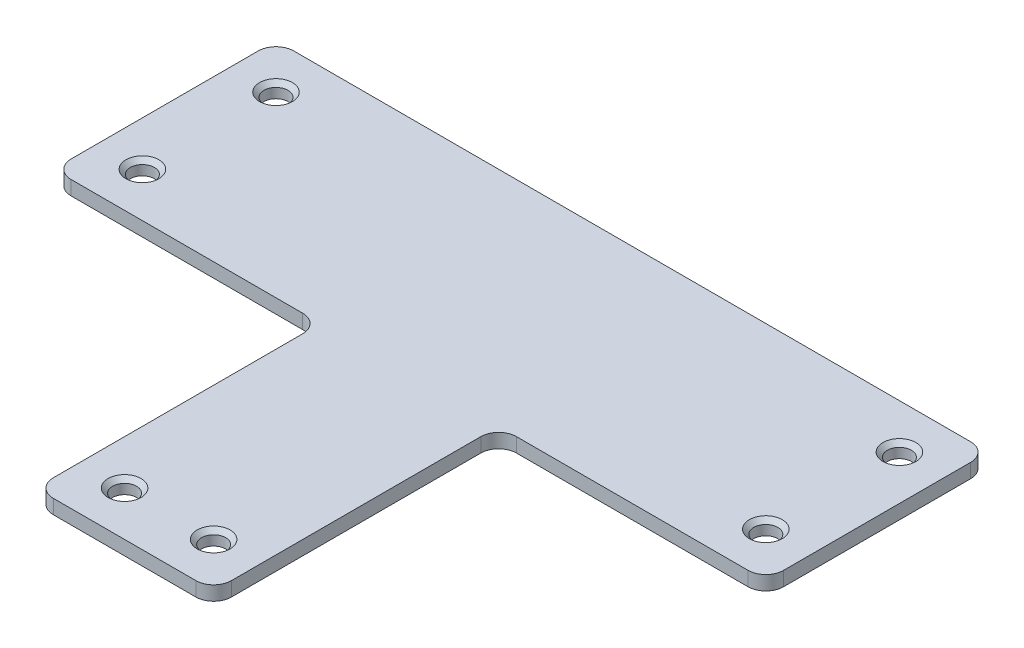
ISO-10303-21;
HEADER;
FILE_DESCRIPTION(('STEP AP214'),'2;1');
FILE_NAME('part.step','',(''),(''),'','','');
FILE_SCHEMA(('AUTOMOTIVE_DESIGN { 1 0 10303 214 1 1 1 1 }'));
ENDSEC;
DATA;
#1=APPLICATION_CONTEXT('core data for automotive mechanical design processes');
#2=APPLICATION_PROTOCOL_DEFINITION('international standard','automotive_design',2000,#1);
#3=PRODUCT_CONTEXT('',#1,'mechanical');
#4=PRODUCT('Part','Part','',(#3));
#5=PRODUCT_RELATED_PRODUCT_CATEGORY('part','',(#4));
#6=PRODUCT_DEFINITION_FORMATION('','',#4);
#7=PRODUCT_DEFINITION_CONTEXT('part definition',#1,'design');
#8=PRODUCT_DEFINITION('design','',#6,#7);
#9=PRODUCT_DEFINITION_SHAPE('','',#8);
#10=(LENGTH_UNIT() NAMED_UNIT(*) SI_UNIT(.MILLI.,.METRE.));
#11=(NAMED_UNIT(*) PLANE_ANGLE_UNIT() SI_UNIT($,.RADIAN.));
#12=(NAMED_UNIT(*) SI_UNIT($,.STERADIAN.) SOLID_ANGLE_UNIT());
#13=UNCERTAINTY_MEASURE_WITH_UNIT(LENGTH_MEASURE(1.E-05),#10,'distance_accuracy_value','');
#14=(GEOMETRIC_REPRESENTATION_CONTEXT(3) GLOBAL_UNCERTAINTY_ASSIGNED_CONTEXT((#13)) GLOBAL_UNIT_ASSIGNED_CONTEXT((#10,
#11,#12)) REPRESENTATION_CONTEXT('',''));
#15=CARTESIAN_POINT('',(0.,0.,0.));
#16=DIRECTION('',(0.,0.,1.));
#17=DIRECTION('',(1.,0.,0.));
#18=AXIS2_PLACEMENT_3D('',#15,#16,#17);
#19=CARTESIAN_POINT('',(-40.,1.6,12.5));
#20=DIRECTION('',(0.,0.,-1.));
#21=DIRECTION('',(-1.,0.,0.));
#22=AXIS2_PLACEMENT_3D('',#19,#20,#21);
#23=PLANE('',#22);
#24=DIRECTION('',(1.,0.,0.));
#25=VECTOR('',#24,1.);
#26=CARTESIAN_POINT('',(-40.,0.,12.5));
#27=LINE('',#26,#25);
#28=CARTESIAN_POINT('',(12.,0.,12.5));
#29=VERTEX_POINT('',#28);
#30=CARTESIAN_POINT('',(38.,0.,12.5));
#31=VERTEX_POINT('',#30);
#32=EDGE_CURVE('E176',#29,#31,#27,.T.);
#33=ORIENTED_EDGE('',*,*,#32,.T.);
#34=DIRECTION('',(0.,-1.,0.));
#35=VECTOR('',#34,1.);
#36=CARTESIAN_POINT('',(38.,1.6,12.5));
#37=LINE('',#36,#35);
#38=CARTESIAN_POINT('',(38.,1.6,12.5));
#39=VERTEX_POINT('',#38);
#40=EDGE_CURVE('E52',#31,#39,#37,.F.);
#41=ORIENTED_EDGE('',*,*,#40,.T.);
#42=DIRECTION('',(1.,0.,0.));
#43=VECTOR('',#42,1.);
#44=CARTESIAN_POINT('',(-40.,1.6,12.5));
#45=LINE('',#44,#43);
#46=CARTESIAN_POINT('',(12.,1.6,12.5));
#47=VERTEX_POINT('',#46);
#48=EDGE_CURVE('E214',#47,#39,#45,.T.);
#49=ORIENTED_EDGE('',*,*,#48,.F.);
#50=DIRECTION('',(0.,1.,0.));
#51=VECTOR('',#50,1.);
#52=CARTESIAN_POINT('',(12.,1.6,12.5));
#53=LINE('',#52,#51);
#54=EDGE_CURVE('E410',#47,#29,#53,.F.);
#55=ORIENTED_EDGE('',*,*,#54,.T.);
#56=EDGE_LOOP('',(#33,#41,#49,#55));
#57=FACE_BOUND('',#56,.T.);
#58=ADVANCED_FACE('F37',(#57),#23,.F.);
#59=CARTESIAN_POINT('',(40.,1.6,12.5));
#60=DIRECTION('',(-1.,0.,0.));
#61=DIRECTION('',(0.,0.,1.));
#62=AXIS2_PLACEMENT_3D('',#59,#60,#61);
#63=PLANE('',#62);
#64=DIRECTION('',(0.,0.,-1.));
#65=VECTOR('',#64,1.);
#66=CARTESIAN_POINT('',(40.,0.,12.5));
#67=LINE('',#66,#65);
#68=CARTESIAN_POINT('',(40.,0.,10.5));
#69=VERTEX_POINT('',#68);
#70=CARTESIAN_POINT('',(40.,0.,-10.5));
#71=VERTEX_POINT('',#70);
#72=EDGE_CURVE('E181',#69,#71,#67,.T.);
#73=ORIENTED_EDGE('',*,*,#72,.T.);
#74=DIRECTION('',(0.,-1.,0.));
#75=VECTOR('',#74,1.);
#76=CARTESIAN_POINT('',(40.,1.6,-10.5));
#77=LINE('',#76,#75);
#78=CARTESIAN_POINT('',(40.,1.6,-10.5));
#79=VERTEX_POINT('',#78);
#80=EDGE_CURVE('E408',#71,#79,#77,.F.);
#81=ORIENTED_EDGE('',*,*,#80,.T.);
#82=DIRECTION('',(0.,0.,-1.));
#83=VECTOR('',#82,1.);
#84=CARTESIAN_POINT('',(40.,1.6,12.5));
#85=LINE('',#84,#83);
#86=CARTESIAN_POINT('',(40.,1.6,10.5));
#87=VERTEX_POINT('',#86);
#88=EDGE_CURVE('E278',#87,#79,#85,.T.);
#89=ORIENTED_EDGE('',*,*,#88,.F.);
#90=DIRECTION('',(0.,-1.,0.));
#91=VECTOR('',#90,1.);
#92=CARTESIAN_POINT('',(40.,1.6,10.5));
#93=LINE('',#92,#91);
#94=EDGE_CURVE('E405',#87,#69,#93,.T.);
#95=ORIENTED_EDGE('',*,*,#94,.T.);
#96=EDGE_LOOP('',(#73,#81,#89,#95));
#97=FACE_BOUND('',#96,.T.);
#98=ADVANCED_FACE('F326',(#97),#63,.F.);
#99=CARTESIAN_POINT('',(-40.,1.6,-12.5));
#100=DIRECTION('',(0.,0.,1.));
#101=DIRECTION('',(1.,0.,0.));
#102=AXIS2_PLACEMENT_3D('',#99,#100,#101);
#103=PLANE('',#102);
#104=DIRECTION('',(-1.,0.,0.));
#105=VECTOR('',#104,1.);
#106=CARTESIAN_POINT('',(-40.,0.,-12.5));
#107=LINE('',#106,#105);
#108=CARTESIAN_POINT('',(38.,0.,-12.5));
#109=VERTEX_POINT('',#108);
#110=CARTESIAN_POINT('',(-38.,0.,-12.5));
#111=VERTEX_POINT('',#110);
#112=EDGE_CURVE('E177',#109,#111,#107,.T.);
#113=ORIENTED_EDGE('',*,*,#112,.T.);
#114=DIRECTION('',(0.,-1.,0.));
#115=VECTOR('',#114,1.);
#116=CARTESIAN_POINT('',(-38.,1.6,-12.5));
#117=LINE('',#116,#115);
#118=CARTESIAN_POINT('',(-38.,1.6,-12.5));
#119=VERTEX_POINT('',#118);
#120=EDGE_CURVE('E155',#111,#119,#117,.F.);
#121=ORIENTED_EDGE('',*,*,#120,.T.);
#122=DIRECTION('',(-1.,0.,0.));
#123=VECTOR('',#122,1.);
#124=CARTESIAN_POINT('',(-40.,1.6,-12.5));
#125=LINE('',#124,#123);
#126=CARTESIAN_POINT('',(38.,1.6,-12.5));
#127=VERTEX_POINT('',#126);
#128=EDGE_CURVE('E280',#127,#119,#125,.T.);
#129=ORIENTED_EDGE('',*,*,#128,.F.);
#130=DIRECTION('',(0.,-1.,0.));
#131=VECTOR('',#130,1.);
#132=CARTESIAN_POINT('',(38.,1.6,-12.5));
#133=LINE('',#132,#131);
#134=EDGE_CURVE('E160',#127,#109,#133,.T.);
#135=ORIENTED_EDGE('',*,*,#134,.T.);
#136=EDGE_LOOP('',(#113,#121,#129,#135));
#137=FACE_BOUND('',#136,.T.);
#138=ADVANCED_FACE('F331',(#137),#103,.F.);
#139=CARTESIAN_POINT('',(-40.,1.6,12.5));
#140=DIRECTION('',(1.,0.,0.));
#141=DIRECTION('',(0.,0.,-1.));
#142=AXIS2_PLACEMENT_3D('',#139,#140,#141);
#143=PLANE('',#142);
#144=DIRECTION('',(0.,0.,1.));
#145=VECTOR('',#144,1.);
#146=CARTESIAN_POINT('',(-40.,1.6,12.5));
#147=LINE('',#146,#145);
#148=CARTESIAN_POINT('',(-40.,1.6,-10.5));
#149=VERTEX_POINT('',#148);
#150=CARTESIAN_POINT('',(-40.,1.6,10.5));
#151=VERTEX_POINT('',#150);
#152=EDGE_CURVE('E170',#149,#151,#147,.T.);
#153=ORIENTED_EDGE('',*,*,#152,.F.);
#154=DIRECTION('',(0.,-1.,0.));
#155=VECTOR('',#154,1.);
#156=CARTESIAN_POINT('',(-40.,1.6,-10.5));
#157=LINE('',#156,#155);
#158=CARTESIAN_POINT('',(-40.,0.,-10.5));
#159=VERTEX_POINT('',#158);
#160=EDGE_CURVE('E154',#149,#159,#157,.T.);
#161=ORIENTED_EDGE('',*,*,#160,.T.);
#162=DIRECTION('',(0.,0.,1.));
#163=VECTOR('',#162,1.);
#164=CARTESIAN_POINT('',(-40.,0.,12.5));
#165=LINE('',#164,#163);
#166=CARTESIAN_POINT('',(-40.,0.,10.5));
#167=VERTEX_POINT('',#166);
#168=EDGE_CURVE('E167',#159,#167,#165,.T.);
#169=ORIENTED_EDGE('',*,*,#168,.T.);
#170=DIRECTION('',(0.,-1.,0.));
#171=VECTOR('',#170,1.);
#172=CARTESIAN_POINT('',(-40.,1.6,10.5));
#173=LINE('',#172,#171);
#174=EDGE_CURVE('E172',#167,#151,#173,.F.);
#175=ORIENTED_EDGE('',*,*,#174,.T.);
#176=EDGE_LOOP('',(#153,#161,#169,#175));
#177=FACE_BOUND('',#176,.T.);
#178=ADVANCED_FACE('F166',(#177),#143,.F.);
#179=CARTESIAN_POINT('',(-38.,0.,12.5));
#180=VERTEX_POINT('',#179);
#181=CARTESIAN_POINT('',(-12.,0.,12.5));
#182=VERTEX_POINT('',#181);
#183=EDGE_CURVE('E179',#180,#182,#27,.T.);
#184=ORIENTED_EDGE('',*,*,#183,.T.);
#185=DIRECTION('',(0.,1.,0.));
#186=VECTOR('',#185,1.);
#187=CARTESIAN_POINT('',(-12.,1.6,12.5));
#188=LINE('',#187,#186);
#189=CARTESIAN_POINT('',(-12.,1.6,12.5));
#190=VERTEX_POINT('',#189);
#191=EDGE_CURVE('E257',#182,#190,#188,.T.);
#192=ORIENTED_EDGE('',*,*,#191,.T.);
#193=CARTESIAN_POINT('',(-38.,1.6,12.5));
#194=VERTEX_POINT('',#193);
#195=EDGE_CURVE('E217',#194,#190,#45,.T.);
#196=ORIENTED_EDGE('',*,*,#195,.F.);
#197=DIRECTION('',(0.,-1.,0.));
#198=VECTOR('',#197,1.);
#199=CARTESIAN_POINT('',(-38.,1.6,12.5));
#200=LINE('',#199,#198);
#201=EDGE_CURVE('E254',#194,#180,#200,.T.);
#202=ORIENTED_EDGE('',*,*,#201,.T.);
#203=EDGE_LOOP('',(#184,#192,#196,#202));
#204=FACE_BOUND('',#203,.T.);
#205=ADVANCED_FACE('F276',(#204),#23,.F.);
#206=CARTESIAN_POINT('',(0.,1.6,0.));
#207=DIRECTION('',(0.,-1.,0.));
#208=DIRECTION('',(0.,0.,-1.));
#209=AXIS2_PLACEMENT_3D('',#206,#207,#208);
#210=PLANE('',#209);
#211=CARTESIAN_POINT('',(35.,1.6,-7.5));
#212=DIRECTION('',(0.,-1.,0.));
#213=DIRECTION('',(0.,0.,-1.));
#214=AXIS2_PLACEMENT_3D('',#211,#212,#213);
#215=CIRCLE('',#214,1.85000000000003);
#216=CARTESIAN_POINT('',(35.,1.6,-9.35000000000003));
#217=VERTEX_POINT('',#216);
#218=EDGE_CURVE('E610',#217,#217,#215,.T.);
#219=ORIENTED_EDGE('',*,*,#218,.T.);
#220=EDGE_LOOP('',(#219));
#221=FACE_BOUND('',#220,.T.);
#222=CARTESIAN_POINT('',(35.,1.6,7.5));
#223=DIRECTION('',(0.,-1.,0.));
#224=DIRECTION('',(0.,0.,-1.));
#225=AXIS2_PLACEMENT_3D('',#222,#223,#224);
#226=CIRCLE('',#225,1.85000000000003);
#227=CARTESIAN_POINT('',(35.,1.6,5.64999999999997));
#228=VERTEX_POINT('',#227);
#229=EDGE_CURVE('E613',#228,#228,#226,.T.);
#230=ORIENTED_EDGE('',*,*,#229,.T.);
#231=EDGE_LOOP('',(#230));
#232=FACE_BOUND('',#231,.T.);
#233=CARTESIAN_POINT('',(5.00000000000001,1.6,39.5));
#234=DIRECTION('',(0.,-1.,0.));
#235=DIRECTION('',(0.,0.,-1.));
#236=AXIS2_PLACEMENT_3D('',#233,#234,#235);
#237=CIRCLE('',#236,1.85);
#238=CARTESIAN_POINT('',(5.00000000000001,1.6,37.65));
#239=VERTEX_POINT('',#238);
#240=EDGE_CURVE('E616',#239,#239,#237,.T.);
#241=ORIENTED_EDGE('',*,*,#240,.T.);
#242=EDGE_LOOP('',(#241));
#243=FACE_BOUND('',#242,.T.);
#244=CARTESIAN_POINT('',(-4.99999999999999,1.6,39.5));
#245=DIRECTION('',(0.,-1.,0.));
#246=DIRECTION('',(0.,0.,-1.));
#247=AXIS2_PLACEMENT_3D('',#244,#245,#246);
#248=CIRCLE('',#247,1.85);
#249=CARTESIAN_POINT('',(-4.99999999999999,1.6,37.65));
#250=VERTEX_POINT('',#249);
#251=EDGE_CURVE('E619',#250,#250,#248,.T.);
#252=ORIENTED_EDGE('',*,*,#251,.T.);
#253=EDGE_LOOP('',(#252));
#254=FACE_BOUND('',#253,.T.);
#255=CARTESIAN_POINT('',(-35.,1.6,7.5));
#256=DIRECTION('',(0.,-1.,0.));
#257=DIRECTION('',(0.,0.,-1.));
#258=AXIS2_PLACEMENT_3D('',#255,#256,#257);
#259=CIRCLE('',#258,1.85000000000003);
#260=CARTESIAN_POINT('',(-35.,1.6,5.64999999999997));
#261=VERTEX_POINT('',#260);
#262=EDGE_CURVE('E622',#261,#261,#259,.T.);
#263=ORIENTED_EDGE('',*,*,#262,.T.);
#264=EDGE_LOOP('',(#263));
#265=FACE_BOUND('',#264,.T.);
#266=CARTESIAN_POINT('',(-35.,1.6,-7.5));
#267=DIRECTION('',(0.,-1.,0.));
#268=DIRECTION('',(0.,0.,-1.));
#269=AXIS2_PLACEMENT_3D('',#266,#267,#268);
#270=CIRCLE('',#269,1.85000000000003);
#271=CARTESIAN_POINT('',(-35.,1.6,-9.35000000000003));
#272=VERTEX_POINT('',#271);
#273=EDGE_CURVE('E624',#272,#272,#270,.T.);
#274=ORIENTED_EDGE('',*,*,#273,.T.);
#275=EDGE_LOOP('',(#274));
#276=FACE_BOUND('',#275,.T.);
#277=ORIENTED_EDGE('',*,*,#128,.T.);
#278=CARTESIAN_POINT('',(-38.,1.6,-10.5));
#279=DIRECTION('',(0.,-1.,0.));
#280=DIRECTION('',(0.,0.,-1.));
#281=AXIS2_PLACEMENT_3D('',#278,#279,#280);
#282=CIRCLE('',#281,2.);
#283=EDGE_CURVE('E403',#119,#149,#282,.F.);
#284=ORIENTED_EDGE('',*,*,#283,.T.);
#285=ORIENTED_EDGE('',*,*,#152,.T.);
#286=CARTESIAN_POINT('',(-38.,1.6,10.5));
#287=DIRECTION('',(0.,-1.,0.));
#288=DIRECTION('',(0.,0.,-1.));
#289=AXIS2_PLACEMENT_3D('',#286,#287,#288);
#290=CIRCLE('',#289,2.);
#291=EDGE_CURVE('E218',#151,#194,#290,.F.);
#292=ORIENTED_EDGE('',*,*,#291,.T.);
#293=ORIENTED_EDGE('',*,*,#195,.T.);
#294=CARTESIAN_POINT('',(-12.,1.6,14.5));
#295=DIRECTION('',(0.,-1.,0.));
#296=DIRECTION('',(0.,0.,-1.));
#297=AXIS2_PLACEMENT_3D('',#294,#295,#296);
#298=CIRCLE('',#297,2.);
#299=CARTESIAN_POINT('',(-9.99999999999999,1.6,14.5));
#300=VERTEX_POINT('',#299);
#301=EDGE_CURVE('E45',#190,#300,#298,.T.);
#302=ORIENTED_EDGE('',*,*,#301,.T.);
#303=DIRECTION('',(0.,0.,1.));
#304=VECTOR('',#303,1.);
#305=CARTESIAN_POINT('',(-9.99999999999999,1.6,12.5));
#306=LINE('',#305,#304);
#307=CARTESIAN_POINT('',(-9.99999999999999,1.6,42.5));
#308=VERTEX_POINT('',#307);
#309=EDGE_CURVE('E212',#300,#308,#306,.T.);
#310=ORIENTED_EDGE('',*,*,#309,.T.);
#311=CARTESIAN_POINT('',(-7.99999999999999,1.6,42.5));
#312=DIRECTION('',(0.,-1.,0.));
#313=DIRECTION('',(0.,0.,-1.));
#314=AXIS2_PLACEMENT_3D('',#311,#312,#313);
#315=CIRCLE('',#314,2.);
#316=CARTESIAN_POINT('',(-7.99999999999999,1.6,44.5));
#317=VERTEX_POINT('',#316);
#318=EDGE_CURVE('E253',#308,#317,#315,.F.);
#319=ORIENTED_EDGE('',*,*,#318,.T.);
#320=DIRECTION('',(1.,0.,0.));
#321=VECTOR('',#320,1.);
#322=CARTESIAN_POINT('',(-9.99999999999999,1.6,44.5));
#323=LINE('',#322,#321);
#324=CARTESIAN_POINT('',(8.00000000000001,1.6,44.5));
#325=VERTEX_POINT('',#324);
#326=EDGE_CURVE('E211',#317,#325,#323,.T.);
#327=ORIENTED_EDGE('',*,*,#326,.T.);
#328=CARTESIAN_POINT('',(8.00000000000001,1.6,42.5));
#329=DIRECTION('',(0.,-1.,0.));
#330=DIRECTION('',(0.,0.,-1.));
#331=AXIS2_PLACEMENT_3D('',#328,#329,#330);
#332=CIRCLE('',#331,2.);
#333=CARTESIAN_POINT('',(10.,1.6,42.5));
#334=VERTEX_POINT('',#333);
#335=EDGE_CURVE('E395',#325,#334,#332,.F.);
#336=ORIENTED_EDGE('',*,*,#335,.T.);
#337=DIRECTION('',(0.,0.,-1.));
#338=VECTOR('',#337,1.);
#339=CARTESIAN_POINT('',(10.,1.6,12.5));
#340=LINE('',#339,#338);
#341=CARTESIAN_POINT('',(10.,1.6,14.5));
#342=VERTEX_POINT('',#341);
#343=EDGE_CURVE('E208',#334,#342,#340,.T.);
#344=ORIENTED_EDGE('',*,*,#343,.T.);
#345=CARTESIAN_POINT('',(12.,1.6,14.5));
#346=DIRECTION('',(0.,-1.,0.));
#347=DIRECTION('',(0.,0.,-1.));
#348=AXIS2_PLACEMENT_3D('',#345,#346,#347);
#349=CIRCLE('',#348,2.);
#350=EDGE_CURVE('E59',#342,#47,#349,.T.);
#351=ORIENTED_EDGE('',*,*,#350,.T.);
#352=ORIENTED_EDGE('',*,*,#48,.T.);
#353=CARTESIAN_POINT('',(38.,1.6,10.5));
#354=DIRECTION('',(0.,-1.,0.));
#355=DIRECTION('',(0.,0.,-1.));
#356=AXIS2_PLACEMENT_3D('',#353,#354,#355);
#357=CIRCLE('',#356,2.);
#358=EDGE_CURVE('E397',#39,#87,#357,.F.);
#359=ORIENTED_EDGE('',*,*,#358,.T.);
#360=ORIENTED_EDGE('',*,*,#88,.T.);
#361=CARTESIAN_POINT('',(38.,1.6,-10.5));
#362=DIRECTION('',(0.,-1.,0.));
#363=DIRECTION('',(0.,0.,-1.));
#364=AXIS2_PLACEMENT_3D('',#361,#362,#363);
#365=CIRCLE('',#364,2.);
#366=EDGE_CURVE('E401',#79,#127,#365,.F.);
#367=ORIENTED_EDGE('',*,*,#366,.T.);
#368=EDGE_LOOP('',(#277,#284,#285,#292,#293,#302,#310,#319,#327,#336,#344,#351,#352,#359,#360,#367));
#369=FACE_BOUND('',#368,.T.);
#370=ADVANCED_FACE('F268',(#221,#232,#243,#254,#265,#276,#369),#210,.F.);
#371=CARTESIAN_POINT('',(0.,0.,0.));
#372=DIRECTION('',(0.,-1.,0.));
#373=DIRECTION('',(0.,0.,-1.));
#374=AXIS2_PLACEMENT_3D('',#371,#372,#373);
#375=PLANE('',#374);
#376=CARTESIAN_POINT('',(5.00000000000001,0.,39.5));
#377=DIRECTION('',(0.,1.,0.));
#378=DIRECTION('',(0.,0.,1.));
#379=AXIS2_PLACEMENT_3D('',#376,#377,#378);
#380=CIRCLE('',#379,1.35);
#381=CARTESIAN_POINT('',(5.00000000000001,0.,40.85));
#382=VERTEX_POINT('',#381);
#383=EDGE_CURVE('E302',#382,#382,#380,.T.);
#384=ORIENTED_EDGE('',*,*,#383,.T.);
#385=EDGE_LOOP('',(#384));
#386=FACE_BOUND('',#385,.T.);
#387=CARTESIAN_POINT('',(-4.99999999999999,0.,39.5));
#388=DIRECTION('',(0.,1.,0.));
#389=DIRECTION('',(0.,0.,1.));
#390=AXIS2_PLACEMENT_3D('',#387,#388,#389);
#391=CIRCLE('',#390,1.35);
#392=CARTESIAN_POINT('',(-4.99999999999999,0.,40.85));
#393=VERTEX_POINT('',#392);
#394=EDGE_CURVE('E299',#393,#393,#391,.T.);
#395=ORIENTED_EDGE('',*,*,#394,.T.);
#396=EDGE_LOOP('',(#395));
#397=FACE_BOUND('',#396,.T.);
#398=CARTESIAN_POINT('',(35.,0.,7.5));
#399=DIRECTION('',(0.,1.,0.));
#400=DIRECTION('',(0.,0.,1.));
#401=AXIS2_PLACEMENT_3D('',#398,#399,#400);
#402=CIRCLE('',#401,1.35);
#403=CARTESIAN_POINT('',(35.,0.,8.85));
#404=VERTEX_POINT('',#403);
#405=EDGE_CURVE('E296',#404,#404,#402,.T.);
#406=ORIENTED_EDGE('',*,*,#405,.T.);
#407=EDGE_LOOP('',(#406));
#408=FACE_BOUND('',#407,.T.);
#409=CARTESIAN_POINT('',(-35.,0.,7.5));
#410=DIRECTION('',(0.,1.,0.));
#411=DIRECTION('',(0.,0.,1.));
#412=AXIS2_PLACEMENT_3D('',#409,#410,#411);
#413=CIRCLE('',#412,1.35);
#414=CARTESIAN_POINT('',(-35.,0.,8.85));
#415=VERTEX_POINT('',#414);
#416=EDGE_CURVE('E293',#415,#415,#413,.T.);
#417=ORIENTED_EDGE('',*,*,#416,.T.);
#418=EDGE_LOOP('',(#417));
#419=FACE_BOUND('',#418,.T.);
#420=CARTESIAN_POINT('',(35.,0.,-7.5));
#421=DIRECTION('',(0.,1.,0.));
#422=DIRECTION('',(0.,0.,1.));
#423=AXIS2_PLACEMENT_3D('',#420,#421,#422);
#424=CIRCLE('',#423,1.35);
#425=CARTESIAN_POINT('',(35.,0.,-6.15));
#426=VERTEX_POINT('',#425);
#427=EDGE_CURVE('E290',#426,#426,#424,.T.);
#428=ORIENTED_EDGE('',*,*,#427,.T.);
#429=EDGE_LOOP('',(#428));
#430=FACE_BOUND('',#429,.T.);
#431=CARTESIAN_POINT('',(-35.,0.,-7.5));
#432=DIRECTION('',(0.,1.,0.));
#433=DIRECTION('',(0.,0.,1.));
#434=AXIS2_PLACEMENT_3D('',#431,#432,#433);
#435=CIRCLE('',#434,1.35);
#436=CARTESIAN_POINT('',(-35.,0.,-6.15));
#437=VERTEX_POINT('',#436);
#438=EDGE_CURVE('E272',#437,#437,#435,.T.);
#439=ORIENTED_EDGE('',*,*,#438,.T.);
#440=EDGE_LOOP('',(#439));
#441=FACE_BOUND('',#440,.T.);
#442=ORIENTED_EDGE('',*,*,#168,.F.);
#443=CARTESIAN_POINT('',(-38.,0.,-10.5));
#444=DIRECTION('',(0.,-1.,0.));
#445=DIRECTION('',(0.,0.,-1.));
#446=AXIS2_PLACEMENT_3D('',#443,#444,#445);
#447=CIRCLE('',#446,2.);
#448=EDGE_CURVE('E150',#159,#111,#447,.T.);
#449=ORIENTED_EDGE('',*,*,#448,.T.);
#450=ORIENTED_EDGE('',*,*,#112,.F.);
#451=CARTESIAN_POINT('',(38.,0.,-10.5));
#452=DIRECTION('',(0.,-1.,0.));
#453=DIRECTION('',(0.,0.,-1.));
#454=AXIS2_PLACEMENT_3D('',#451,#452,#453);
#455=CIRCLE('',#454,2.);
#456=EDGE_CURVE('E161',#109,#71,#455,.T.);
#457=ORIENTED_EDGE('',*,*,#456,.T.);
#458=ORIENTED_EDGE('',*,*,#72,.F.);
#459=CARTESIAN_POINT('',(38.,0.,10.5));
#460=DIRECTION('',(0.,-1.,0.));
#461=DIRECTION('',(0.,0.,-1.));
#462=AXIS2_PLACEMENT_3D('',#459,#460,#461);
#463=CIRCLE('',#462,2.);
#464=EDGE_CURVE('E230',#69,#31,#463,.T.);
#465=ORIENTED_EDGE('',*,*,#464,.T.);
#466=ORIENTED_EDGE('',*,*,#32,.F.);
#467=CARTESIAN_POINT('',(12.,0.,14.5));
#468=DIRECTION('',(0.,-1.,0.));
#469=DIRECTION('',(0.,0.,-1.));
#470=AXIS2_PLACEMENT_3D('',#467,#468,#469);
#471=CIRCLE('',#470,2.);
#472=CARTESIAN_POINT('',(10.,0.,14.5));
#473=VERTEX_POINT('',#472);
#474=EDGE_CURVE('E266',#29,#473,#471,.F.);
#475=ORIENTED_EDGE('',*,*,#474,.T.);
#476=DIRECTION('',(0.,0.,-1.));
#477=VECTOR('',#476,1.);
#478=CARTESIAN_POINT('',(10.,0.,12.5));
#479=LINE('',#478,#477);
#480=CARTESIAN_POINT('',(10.,0.,42.5));
#481=VERTEX_POINT('',#480);
#482=EDGE_CURVE('E195',#481,#473,#479,.T.);
#483=ORIENTED_EDGE('',*,*,#482,.F.);
#484=CARTESIAN_POINT('',(8.00000000000001,0.,42.5));
#485=DIRECTION('',(0.,-1.,0.));
#486=DIRECTION('',(0.,0.,-1.));
#487=AXIS2_PLACEMENT_3D('',#484,#485,#486);
#488=CIRCLE('',#487,2.);
#489=CARTESIAN_POINT('',(8.00000000000001,0.,44.5));
#490=VERTEX_POINT('',#489);
#491=EDGE_CURVE('E232',#481,#490,#488,.T.);
#492=ORIENTED_EDGE('',*,*,#491,.T.);
#493=DIRECTION('',(1.,0.,0.));
#494=VECTOR('',#493,1.);
#495=CARTESIAN_POINT('',(-9.99999999999999,0.,44.5));
#496=LINE('',#495,#494);
#497=CARTESIAN_POINT('',(-7.99999999999999,0.,44.5));
#498=VERTEX_POINT('',#497);
#499=EDGE_CURVE('E198',#498,#490,#496,.T.);
#500=ORIENTED_EDGE('',*,*,#499,.F.);
#501=CARTESIAN_POINT('',(-7.99999999999999,0.,42.5));
#502=DIRECTION('',(0.,-1.,0.));
#503=DIRECTION('',(0.,0.,-1.));
#504=AXIS2_PLACEMENT_3D('',#501,#502,#503);
#505=CIRCLE('',#504,2.);
#506=CARTESIAN_POINT('',(-9.99999999999999,0.,42.5));
#507=VERTEX_POINT('',#506);
#508=EDGE_CURVE('E234',#498,#507,#505,.T.);
#509=ORIENTED_EDGE('',*,*,#508,.T.);
#510=DIRECTION('',(0.,0.,1.));
#511=VECTOR('',#510,1.);
#512=CARTESIAN_POINT('',(-9.99999999999999,0.,12.5));
#513=LINE('',#512,#511);
#514=CARTESIAN_POINT('',(-9.99999999999999,0.,14.5));
#515=VERTEX_POINT('',#514);
#516=EDGE_CURVE('E199',#515,#507,#513,.T.);
#517=ORIENTED_EDGE('',*,*,#516,.F.);
#518=CARTESIAN_POINT('',(-12.,0.,14.5));
#519=DIRECTION('',(0.,-1.,0.));
#520=DIRECTION('',(0.,0.,-1.));
#521=AXIS2_PLACEMENT_3D('',#518,#519,#520);
#522=CIRCLE('',#521,2.);
#523=EDGE_CURVE('E11',#515,#182,#522,.F.);
#524=ORIENTED_EDGE('',*,*,#523,.T.);
#525=ORIENTED_EDGE('',*,*,#183,.F.);
#526=CARTESIAN_POINT('',(-38.,0.,10.5));
#527=DIRECTION('',(0.,-1.,0.));
#528=DIRECTION('',(0.,0.,-1.));
#529=AXIS2_PLACEMENT_3D('',#526,#527,#528);
#530=CIRCLE('',#529,2.);
#531=EDGE_CURVE('E171',#180,#167,#530,.T.);
#532=ORIENTED_EDGE('',*,*,#531,.T.);
#533=EDGE_LOOP('',(#442,#449,#450,#457,#458,#465,#466,#475,#483,#492,#500,#509,#517,#524,#525,#532));
#534=FACE_BOUND('',#533,.T.);
#535=ADVANCED_FACE('F174',(#386,#397,#408,#419,#430,#441,#534),#375,.T.);
#536=CARTESIAN_POINT('',(-9.99999999999999,0.,12.5));
#537=DIRECTION('',(-1.,0.,0.));
#538=DIRECTION('',(0.,0.,1.));
#539=AXIS2_PLACEMENT_3D('',#536,#537,#538);
#540=PLANE('',#539);
#541=ORIENTED_EDGE('',*,*,#516,.T.);
#542=DIRECTION('',(0.,1.,0.));
#543=VECTOR('',#542,1.);
#544=CARTESIAN_POINT('',(-9.99999999999999,0.,42.5));
#545=LINE('',#544,#543);
#546=EDGE_CURVE('E248',#507,#308,#545,.T.);
#547=ORIENTED_EDGE('',*,*,#546,.T.);
#548=ORIENTED_EDGE('',*,*,#309,.F.);
#549=DIRECTION('',(0.,1.,0.));
#550=VECTOR('',#549,1.);
#551=CARTESIAN_POINT('',(-9.99999999999999,0.,14.5));
#552=LINE('',#551,#550);
#553=EDGE_CURVE('E251',#300,#515,#552,.F.);
#554=ORIENTED_EDGE('',*,*,#553,.T.);
#555=EDGE_LOOP('',(#541,#547,#548,#554));
#556=FACE_BOUND('',#555,.T.);
#557=ADVANCED_FACE('F246',(#556),#540,.T.);
#558=CARTESIAN_POINT('',(10.,0.,12.5));
#559=DIRECTION('',(1.,0.,0.));
#560=DIRECTION('',(0.,0.,-1.));
#561=AXIS2_PLACEMENT_3D('',#558,#559,#560);
#562=PLANE('',#561);
#563=ORIENTED_EDGE('',*,*,#482,.T.);
#564=DIRECTION('',(0.,1.,0.));
#565=VECTOR('',#564,1.);
#566=CARTESIAN_POINT('',(10.,0.,14.5));
#567=LINE('',#566,#565);
#568=EDGE_CURVE('E415',#473,#342,#567,.T.);
#569=ORIENTED_EDGE('',*,*,#568,.T.);
#570=ORIENTED_EDGE('',*,*,#343,.F.);
#571=DIRECTION('',(0.,1.,0.));
#572=VECTOR('',#571,1.);
#573=CARTESIAN_POINT('',(10.,0.,42.5));
#574=LINE('',#573,#572);
#575=EDGE_CURVE('E413',#334,#481,#574,.F.);
#576=ORIENTED_EDGE('',*,*,#575,.T.);
#577=EDGE_LOOP('',(#563,#569,#570,#576));
#578=FACE_BOUND('',#577,.T.);
#579=ADVANCED_FACE('F427',(#578),#562,.T.);
#580=CARTESIAN_POINT('',(-9.99999999999999,0.,44.5));
#581=DIRECTION('',(0.,0.,1.));
#582=DIRECTION('',(1.,0.,0.));
#583=AXIS2_PLACEMENT_3D('',#580,#581,#582);
#584=PLANE('',#583);
#585=ORIENTED_EDGE('',*,*,#499,.T.);
#586=DIRECTION('',(0.,1.,0.));
#587=VECTOR('',#586,1.);
#588=CARTESIAN_POINT('',(8.00000000000001,0.,44.5));
#589=LINE('',#588,#587);
#590=EDGE_CURVE('E259',#490,#325,#589,.T.);
#591=ORIENTED_EDGE('',*,*,#590,.T.);
#592=ORIENTED_EDGE('',*,*,#326,.F.);
#593=DIRECTION('',(0.,1.,0.));
#594=VECTOR('',#593,1.);
#595=CARTESIAN_POINT('',(-7.99999999999999,0.,44.5));
#596=LINE('',#595,#594);
#597=EDGE_CURVE('E418',#317,#498,#596,.F.);
#598=ORIENTED_EDGE('',*,*,#597,.T.);
#599=EDGE_LOOP('',(#585,#591,#592,#598));
#600=FACE_BOUND('',#599,.T.);
#601=ADVANCED_FACE('F422',(#600),#584,.T.);
#602=CARTESIAN_POINT('',(-35.,0.,-7.5));
#603=DIRECTION('',(0.,1.,0.));
#604=DIRECTION('',(0.,0.,1.));
#605=AXIS2_PLACEMENT_3D('',#602,#603,#604);
#606=CYLINDRICAL_SURFACE('',#605,1.35);
#607=CARTESIAN_POINT('',(-35.,1.09999999999998,-7.5));
#608=DIRECTION('',(0.,-1.,0.));
#609=DIRECTION('',(0.,0.,-1.));
#610=AXIS2_PLACEMENT_3D('',#607,#608,#609);
#611=CIRCLE('',#610,1.35);
#612=CARTESIAN_POINT('',(-35.,1.09999999999998,-8.85));
#613=VERTEX_POINT('',#612);
#614=EDGE_CURVE('E593',#613,#613,#611,.F.);
#615=ORIENTED_EDGE('',*,*,#614,.T.);
#616=EDGE_LOOP('',(#615));
#617=FACE_BOUND('',#616,.T.);
#618=ORIENTED_EDGE('',*,*,#438,.F.);
#619=EDGE_LOOP('',(#618));
#620=FACE_BOUND('',#619,.T.);
#621=ADVANCED_FACE('F446',(#617,#620),#606,.F.);
#622=CARTESIAN_POINT('',(35.,0.,-7.5));
#623=DIRECTION('',(0.,1.,0.));
#624=DIRECTION('',(0.,0.,1.));
#625=AXIS2_PLACEMENT_3D('',#622,#623,#624);
#626=CYLINDRICAL_SURFACE('',#625,1.35);
#627=CARTESIAN_POINT('',(35.,1.09999999999998,-7.5));
#628=DIRECTION('',(0.,-1.,0.));
#629=DIRECTION('',(0.,0.,-1.));
#630=AXIS2_PLACEMENT_3D('',#627,#628,#629);
#631=CIRCLE('',#630,1.35);
#632=CARTESIAN_POINT('',(35.,1.09999999999998,-8.85));
#633=VERTEX_POINT('',#632);
#634=EDGE_CURVE('E205',#633,#633,#631,.F.);
#635=ORIENTED_EDGE('',*,*,#634,.T.);
#636=EDGE_LOOP('',(#635));
#637=FACE_BOUND('',#636,.T.);
#638=ORIENTED_EDGE('',*,*,#427,.F.);
#639=EDGE_LOOP('',(#638));
#640=FACE_BOUND('',#639,.T.);
#641=ADVANCED_FACE('F571',(#637,#640),#626,.F.);
#642=CARTESIAN_POINT('',(-35.,0.,7.5));
#643=DIRECTION('',(0.,1.,0.));
#644=DIRECTION('',(0.,0.,1.));
#645=AXIS2_PLACEMENT_3D('',#642,#643,#644);
#646=CYLINDRICAL_SURFACE('',#645,1.35);
#647=CARTESIAN_POINT('',(-35.,1.09999999999998,7.5));
#648=DIRECTION('',(0.,-1.,0.));
#649=DIRECTION('',(0.,0.,-1.));
#650=AXIS2_PLACEMENT_3D('',#647,#648,#649);
#651=CIRCLE('',#650,1.35);
#652=CARTESIAN_POINT('',(-35.,1.09999999999998,6.15));
#653=VERTEX_POINT('',#652);
#654=EDGE_CURVE('E597',#653,#653,#651,.F.);
#655=ORIENTED_EDGE('',*,*,#654,.T.);
#656=EDGE_LOOP('',(#655));
#657=FACE_BOUND('',#656,.T.);
#658=ORIENTED_EDGE('',*,*,#416,.F.);
#659=EDGE_LOOP('',(#658));
#660=FACE_BOUND('',#659,.T.);
#661=ADVANCED_FACE('F561',(#657,#660),#646,.F.);
#662=CARTESIAN_POINT('',(35.,0.,7.5));
#663=DIRECTION('',(0.,1.,0.));
#664=DIRECTION('',(0.,0.,1.));
#665=AXIS2_PLACEMENT_3D('',#662,#663,#664);
#666=CYLINDRICAL_SURFACE('',#665,1.35);
#667=CARTESIAN_POINT('',(35.,1.09999999999998,7.5));
#668=DIRECTION('',(0.,-1.,0.));
#669=DIRECTION('',(0.,0.,-1.));
#670=AXIS2_PLACEMENT_3D('',#667,#668,#669);
#671=CIRCLE('',#670,1.35);
#672=CARTESIAN_POINT('',(35.,1.09999999999998,6.15));
#673=VERTEX_POINT('',#672);
#674=EDGE_CURVE('E607',#673,#673,#671,.F.);
#675=ORIENTED_EDGE('',*,*,#674,.T.);
#676=EDGE_LOOP('',(#675));
#677=FACE_BOUND('',#676,.T.);
#678=ORIENTED_EDGE('',*,*,#405,.F.);
#679=EDGE_LOOP('',(#678));
#680=FACE_BOUND('',#679,.T.);
#681=ADVANCED_FACE('F321',(#677,#680),#666,.F.);
#682=CARTESIAN_POINT('',(-4.99999999999999,0.,39.5));
#683=DIRECTION('',(0.,1.,0.));
#684=DIRECTION('',(0.,0.,1.));
#685=AXIS2_PLACEMENT_3D('',#682,#683,#684);
#686=CYLINDRICAL_SURFACE('',#685,1.35);
#687=CARTESIAN_POINT('',(-4.99999999999999,1.1,39.5));
#688=DIRECTION('',(0.,-1.,0.));
#689=DIRECTION('',(0.,0.,-1.));
#690=AXIS2_PLACEMENT_3D('',#687,#688,#689);
#691=CIRCLE('',#690,1.35);
#692=CARTESIAN_POINT('',(-4.99999999999999,1.1,38.15));
#693=VERTEX_POINT('',#692);
#694=EDGE_CURVE('E600',#693,#693,#691,.F.);
#695=ORIENTED_EDGE('',*,*,#694,.T.);
#696=EDGE_LOOP('',(#695));
#697=FACE_BOUND('',#696,.T.);
#698=ORIENTED_EDGE('',*,*,#394,.F.);
#699=EDGE_LOOP('',(#698));
#700=FACE_BOUND('',#699,.T.);
#701=ADVANCED_FACE('F311',(#697,#700),#686,.F.);
#702=CARTESIAN_POINT('',(5.00000000000001,0.,39.5));
#703=DIRECTION('',(0.,1.,0.));
#704=DIRECTION('',(0.,0.,1.));
#705=AXIS2_PLACEMENT_3D('',#702,#703,#704);
#706=CYLINDRICAL_SURFACE('',#705,1.35);
#707=CARTESIAN_POINT('',(5.00000000000001,1.1,39.5));
#708=DIRECTION('',(0.,-1.,0.));
#709=DIRECTION('',(0.,0.,-1.));
#710=AXIS2_PLACEMENT_3D('',#707,#708,#709);
#711=CIRCLE('',#710,1.35);
#712=CARTESIAN_POINT('',(5.00000000000001,1.1,38.15));
#713=VERTEX_POINT('',#712);
#714=EDGE_CURVE('E605',#713,#713,#711,.F.);
#715=ORIENTED_EDGE('',*,*,#714,.T.);
#716=EDGE_LOOP('',(#715));
#717=FACE_BOUND('',#716,.T.);
#718=ORIENTED_EDGE('',*,*,#383,.F.);
#719=EDGE_LOOP('',(#718));
#720=FACE_BOUND('',#719,.T.);
#721=ADVANCED_FACE('F308',(#717,#720),#706,.F.);
#722=CARTESIAN_POINT('',(35.,1.09999999999998,-7.5));
#723=DIRECTION('',(0.,1.,0.));
#724=DIRECTION('',(0.,0.,1.));
#725=AXIS2_PLACEMENT_3D('',#722,#723,#724);
#726=CONICAL_SURFACE('',#725,1.35,0.785398163397458);
#727=ORIENTED_EDGE('',*,*,#218,.F.);
#728=EDGE_LOOP('',(#727));
#729=FACE_BOUND('',#728,.T.);
#730=ORIENTED_EDGE('',*,*,#634,.F.);
#731=EDGE_LOOP('',(#730));
#732=FACE_BOUND('',#731,.T.);
#733=ADVANCED_FACE('F310',(#729,#732),#726,.F.);
#734=CARTESIAN_POINT('',(35.,1.09999999999998,7.5));
#735=DIRECTION('',(0.,1.,0.));
#736=DIRECTION('',(0.,0.,1.));
#737=AXIS2_PLACEMENT_3D('',#734,#735,#736);
#738=CONICAL_SURFACE('',#737,1.35,0.785398163397458);
#739=ORIENTED_EDGE('',*,*,#229,.F.);
#740=EDGE_LOOP('',(#739));
#741=FACE_BOUND('',#740,.T.);
#742=ORIENTED_EDGE('',*,*,#674,.F.);
#743=EDGE_LOOP('',(#742));
#744=FACE_BOUND('',#743,.T.);
#745=ADVANCED_FACE('F318',(#741,#744),#738,.F.);
#746=CARTESIAN_POINT('',(5.00000000000001,1.1,39.5));
#747=DIRECTION('',(0.,1.,0.));
#748=DIRECTION('',(0.,0.,1.));
#749=AXIS2_PLACEMENT_3D('',#746,#747,#748);
#750=CONICAL_SURFACE('',#749,1.35,0.785398163397458);
#751=ORIENTED_EDGE('',*,*,#240,.F.);
#752=EDGE_LOOP('',(#751));
#753=FACE_BOUND('',#752,.T.);
#754=ORIENTED_EDGE('',*,*,#714,.F.);
#755=EDGE_LOOP('',(#754));
#756=FACE_BOUND('',#755,.T.);
#757=ADVANCED_FACE('F351',(#753,#756),#750,.F.);
#758=CARTESIAN_POINT('',(-4.99999999999999,1.1,39.5));
#759=DIRECTION('',(0.,1.,0.));
#760=DIRECTION('',(0.,0.,1.));
#761=AXIS2_PLACEMENT_3D('',#758,#759,#760);
#762=CONICAL_SURFACE('',#761,1.35,0.785398163397458);
#763=ORIENTED_EDGE('',*,*,#251,.F.);
#764=EDGE_LOOP('',(#763));
#765=FACE_BOUND('',#764,.T.);
#766=ORIENTED_EDGE('',*,*,#694,.F.);
#767=EDGE_LOOP('',(#766));
#768=FACE_BOUND('',#767,.T.);
#769=ADVANCED_FACE('F355',(#765,#768),#762,.F.);
#770=CARTESIAN_POINT('',(-35.,1.09999999999998,7.5));
#771=DIRECTION('',(0.,1.,0.));
#772=DIRECTION('',(0.,0.,1.));
#773=AXIS2_PLACEMENT_3D('',#770,#771,#772);
#774=CONICAL_SURFACE('',#773,1.35,0.785398163397458);
#775=ORIENTED_EDGE('',*,*,#262,.F.);
#776=EDGE_LOOP('',(#775));
#777=FACE_BOUND('',#776,.T.);
#778=ORIENTED_EDGE('',*,*,#654,.F.);
#779=EDGE_LOOP('',(#778));
#780=FACE_BOUND('',#779,.T.);
#781=ADVANCED_FACE('F359',(#777,#780),#774,.F.);
#782=CARTESIAN_POINT('',(-35.,1.09999999999998,-7.5));
#783=DIRECTION('',(0.,1.,0.));
#784=DIRECTION('',(0.,0.,1.));
#785=AXIS2_PLACEMENT_3D('',#782,#783,#784);
#786=CONICAL_SURFACE('',#785,1.35,0.785398163397457);
#787=ORIENTED_EDGE('',*,*,#273,.F.);
#788=EDGE_LOOP('',(#787));
#789=FACE_BOUND('',#788,.T.);
#790=ORIENTED_EDGE('',*,*,#614,.F.);
#791=EDGE_LOOP('',(#790));
#792=FACE_BOUND('',#791,.T.);
#793=ADVANCED_FACE('F363',(#789,#792),#786,.F.);
#794=CARTESIAN_POINT('',(-38.,1.6,-10.5));
#795=DIRECTION('',(0.,-1.,0.));
#796=DIRECTION('',(0.,0.,-1.));
#797=AXIS2_PLACEMENT_3D('',#794,#795,#796);
#798=CYLINDRICAL_SURFACE('',#797,2.);
#799=ORIENTED_EDGE('',*,*,#283,.F.);
#800=ORIENTED_EDGE('',*,*,#120,.F.);
#801=ORIENTED_EDGE('',*,*,#448,.F.);
#802=ORIENTED_EDGE('',*,*,#160,.F.);
#803=EDGE_LOOP('',(#799,#800,#801,#802));
#804=FACE_BOUND('',#803,.T.);
#805=ADVANCED_FACE('F153',(#804),#798,.T.);
#806=CARTESIAN_POINT('',(38.,1.6,-10.5));
#807=DIRECTION('',(0.,-1.,0.));
#808=DIRECTION('',(0.,0.,-1.));
#809=AXIS2_PLACEMENT_3D('',#806,#807,#808);
#810=CYLINDRICAL_SURFACE('',#809,2.);
#811=ORIENTED_EDGE('',*,*,#366,.F.);
#812=ORIENTED_EDGE('',*,*,#80,.F.);
#813=ORIENTED_EDGE('',*,*,#456,.F.);
#814=ORIENTED_EDGE('',*,*,#134,.F.);
#815=EDGE_LOOP('',(#811,#812,#813,#814));
#816=FACE_BOUND('',#815,.T.);
#817=ADVANCED_FACE('F370',(#816),#810,.T.);
#818=CARTESIAN_POINT('',(38.,1.6,10.5));
#819=DIRECTION('',(0.,-1.,0.));
#820=DIRECTION('',(0.,0.,-1.));
#821=AXIS2_PLACEMENT_3D('',#818,#819,#820);
#822=CYLINDRICAL_SURFACE('',#821,2.);
#823=ORIENTED_EDGE('',*,*,#358,.F.);
#824=ORIENTED_EDGE('',*,*,#40,.F.);
#825=ORIENTED_EDGE('',*,*,#464,.F.);
#826=ORIENTED_EDGE('',*,*,#94,.F.);
#827=EDGE_LOOP('',(#823,#824,#825,#826));
#828=FACE_BOUND('',#827,.T.);
#829=ADVANCED_FACE('F373',(#828),#822,.T.);
#830=CARTESIAN_POINT('',(12.,0.,14.5));
#831=DIRECTION('',(0.,1.,0.));
#832=DIRECTION('',(0.,0.,1.));
#833=AXIS2_PLACEMENT_3D('',#830,#831,#832);
#834=CYLINDRICAL_SURFACE('',#833,2.);
#835=ORIENTED_EDGE('',*,*,#474,.F.);
#836=ORIENTED_EDGE('',*,*,#54,.F.);
#837=ORIENTED_EDGE('',*,*,#350,.F.);
#838=ORIENTED_EDGE('',*,*,#568,.F.);
#839=EDGE_LOOP('',(#835,#836,#837,#838));
#840=FACE_BOUND('',#839,.T.);
#841=ADVANCED_FACE('F377',(#840),#834,.F.);
#842=CARTESIAN_POINT('',(8.00000000000001,0.,42.5));
#843=DIRECTION('',(0.,1.,0.));
#844=DIRECTION('',(0.,0.,1.));
#845=AXIS2_PLACEMENT_3D('',#842,#843,#844);
#846=CYLINDRICAL_SURFACE('',#845,2.);
#847=ORIENTED_EDGE('',*,*,#491,.F.);
#848=ORIENTED_EDGE('',*,*,#575,.F.);
#849=ORIENTED_EDGE('',*,*,#335,.F.);
#850=ORIENTED_EDGE('',*,*,#590,.F.);
#851=EDGE_LOOP('',(#847,#848,#849,#850));
#852=FACE_BOUND('',#851,.T.);
#853=ADVANCED_FACE('F381',(#852),#846,.T.);
#854=CARTESIAN_POINT('',(-7.99999999999999,0.,42.5));
#855=DIRECTION('',(0.,1.,0.));
#856=DIRECTION('',(0.,0.,1.));
#857=AXIS2_PLACEMENT_3D('',#854,#855,#856);
#858=CYLINDRICAL_SURFACE('',#857,2.);
#859=ORIENTED_EDGE('',*,*,#508,.F.);
#860=ORIENTED_EDGE('',*,*,#597,.F.);
#861=ORIENTED_EDGE('',*,*,#318,.F.);
#862=ORIENTED_EDGE('',*,*,#546,.F.);
#863=EDGE_LOOP('',(#859,#860,#861,#862));
#864=FACE_BOUND('',#863,.T.);
#865=ADVANCED_FACE('F252',(#864),#858,.T.);
#866=CARTESIAN_POINT('',(-12.,1.6,14.5));
#867=DIRECTION('',(0.,1.,0.));
#868=DIRECTION('',(0.,0.,1.));
#869=AXIS2_PLACEMENT_3D('',#866,#867,#868);
#870=CYLINDRICAL_SURFACE('',#869,2.);
#871=ORIENTED_EDGE('',*,*,#523,.F.);
#872=ORIENTED_EDGE('',*,*,#553,.F.);
#873=ORIENTED_EDGE('',*,*,#301,.F.);
#874=ORIENTED_EDGE('',*,*,#191,.F.);
#875=EDGE_LOOP('',(#871,#872,#873,#874));
#876=FACE_BOUND('',#875,.T.);
#877=ADVANCED_FACE('F273',(#876),#870,.F.);
#878=CARTESIAN_POINT('',(-38.,1.6,10.5));
#879=DIRECTION('',(0.,-1.,0.));
#880=DIRECTION('',(0.,0.,-1.));
#881=AXIS2_PLACEMENT_3D('',#878,#879,#880);
#882=CYLINDRICAL_SURFACE('',#881,2.);
#883=ORIENTED_EDGE('',*,*,#291,.F.);
#884=ORIENTED_EDGE('',*,*,#174,.F.);
#885=ORIENTED_EDGE('',*,*,#531,.F.);
#886=ORIENTED_EDGE('',*,*,#201,.F.);
#887=EDGE_LOOP('',(#883,#884,#885,#886));
#888=FACE_BOUND('',#887,.T.);
#889=ADVANCED_FACE('F39',(#888),#882,.T.);
#890=CLOSED_SHELL('',(#58,#98,#138,#178,#205,#370,#535,#557,#579,#601,#621,#641,#661,#681,#701,
#721,#733,#745,#757,#769,#781,#793,#805,#817,#829,#841,#853,#865,#877,#889));
#891=MANIFOLD_SOLID_BREP('B2',#890);
#892=ADVANCED_BREP_SHAPE_REPRESENTATION('',(#18,#891),#14);
#893=SHAPE_DEFINITION_REPRESENTATION(#9,#892);
ENDSEC;
END-ISO-10303-21;
